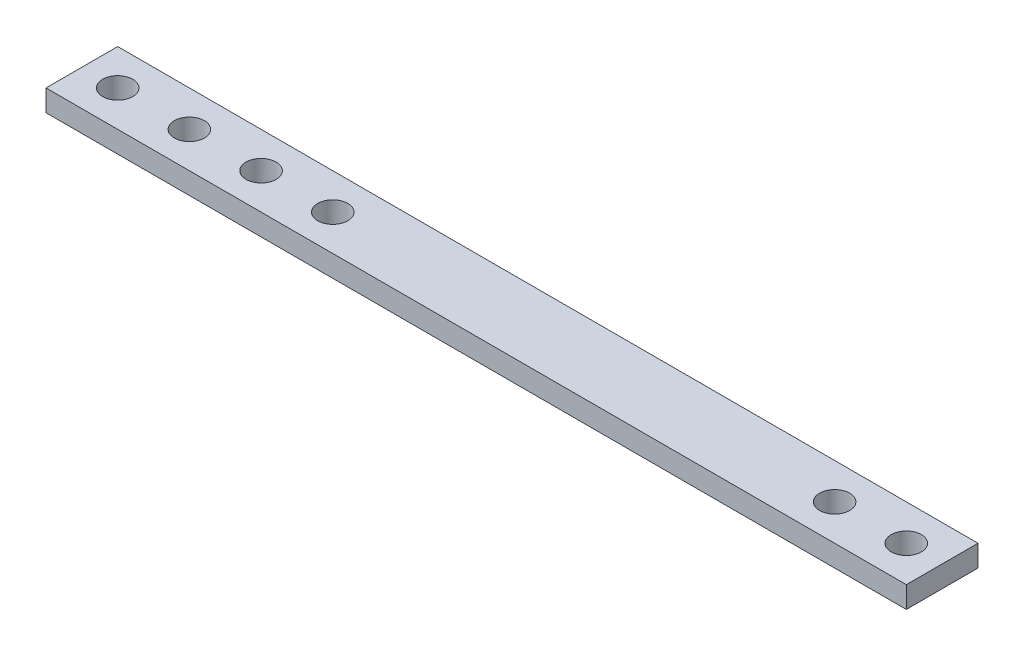
ISO-10303-21;
HEADER;
FILE_DESCRIPTION(('STEP AP214'),'2;1');
FILE_NAME('part.step','',(''),(''),'','','');
FILE_SCHEMA(('AUTOMOTIVE_DESIGN { 1 0 10303 214 1 1 1 1 }'));
ENDSEC;
DATA;
#1=APPLICATION_CONTEXT('core data for automotive mechanical design processes');
#2=APPLICATION_PROTOCOL_DEFINITION('international standard','automotive_design',2000,#1);
#3=PRODUCT_CONTEXT('',#1,'mechanical');
#4=PRODUCT('Part','Part','',(#3));
#5=PRODUCT_RELATED_PRODUCT_CATEGORY('part','',(#4));
#6=PRODUCT_DEFINITION_FORMATION('','',#4);
#7=PRODUCT_DEFINITION_CONTEXT('part definition',#1,'design');
#8=PRODUCT_DEFINITION('design','',#6,#7);
#9=PRODUCT_DEFINITION_SHAPE('','',#8);
#10=(LENGTH_UNIT() NAMED_UNIT(*) SI_UNIT(.MILLI.,.METRE.));
#11=(NAMED_UNIT(*) PLANE_ANGLE_UNIT() SI_UNIT($,.RADIAN.));
#12=(NAMED_UNIT(*) SI_UNIT($,.STERADIAN.) SOLID_ANGLE_UNIT());
#13=UNCERTAINTY_MEASURE_WITH_UNIT(LENGTH_MEASURE(1.E-05),#10,'distance_accuracy_value','');
#14=(GEOMETRIC_REPRESENTATION_CONTEXT(3) GLOBAL_UNCERTAINTY_ASSIGNED_CONTEXT((#13)) GLOBAL_UNIT_ASSIGNED_CONTEXT((#10,
#11,#12)) REPRESENTATION_CONTEXT('',''));
#15=CARTESIAN_POINT('',(0.,0.,0.));
#16=DIRECTION('',(0.,0.,1.));
#17=DIRECTION('',(1.,0.,0.));
#18=AXIS2_PLACEMENT_3D('',#15,#16,#17);
#19=CARTESIAN_POINT('',(0.,3.,0.));
#20=DIRECTION('',(0.,-1.,0.));
#21=DIRECTION('',(0.,0.,-1.));
#22=AXIS2_PLACEMENT_3D('',#19,#20,#21);
#23=PLANE('',#22);
#24=CARTESIAN_POINT('',(55.,3.,0.));
#25=DIRECTION('',(0.,1.,0.));
#26=DIRECTION('',(0.,0.,1.));
#27=AXIS2_PLACEMENT_3D('',#24,#25,#26);
#28=CIRCLE('',#27,2.1);
#29=CARTESIAN_POINT('',(55.,3.,2.1));
#30=VERTEX_POINT('',#29);
#31=EDGE_CURVE('E170',#30,#30,#28,.T.);
#32=ORIENTED_EDGE('',*,*,#31,.F.);
#33=EDGE_LOOP('',(#32));
#34=FACE_BOUND('',#33,.T.);
#35=CARTESIAN_POINT('',(45.,3.,0.));
#36=DIRECTION('',(0.,1.,0.));
#37=DIRECTION('',(0.,0.,1.));
#38=AXIS2_PLACEMENT_3D('',#35,#36,#37);
#39=CIRCLE('',#38,2.1);
#40=CARTESIAN_POINT('',(45.,3.,2.10000000000007));
#41=VERTEX_POINT('',#40);
#42=EDGE_CURVE('E162',#41,#41,#39,.T.);
#43=ORIENTED_EDGE('',*,*,#42,.F.);
#44=EDGE_LOOP('',(#43));
#45=FACE_BOUND('',#44,.T.);
#46=DIRECTION('',(0.,0.,-1.));
#47=VECTOR('',#46,1.);
#48=CARTESIAN_POINT('',(60.,3.,5.));
#49=LINE('',#48,#47);
#50=CARTESIAN_POINT('',(60.,3.,5.));
#51=VERTEX_POINT('',#50);
#52=CARTESIAN_POINT('',(60.,3.,-5.));
#53=VERTEX_POINT('',#52);
#54=EDGE_CURVE('E92',#51,#53,#49,.T.);
#55=ORIENTED_EDGE('',*,*,#54,.T.);
#56=DIRECTION('',(-1.,0.,0.));
#57=VECTOR('',#56,1.);
#58=CARTESIAN_POINT('',(-60.,3.,-5.));
#59=LINE('',#58,#57);
#60=CARTESIAN_POINT('',(-60.,3.,-5.));
#61=VERTEX_POINT('',#60);
#62=EDGE_CURVE('E87',#53,#61,#59,.T.);
#63=ORIENTED_EDGE('',*,*,#62,.T.);
#64=DIRECTION('',(0.,0.,1.));
#65=VECTOR('',#64,1.);
#66=CARTESIAN_POINT('',(-60.,3.,5.));
#67=LINE('',#66,#65);
#68=CARTESIAN_POINT('',(-60.,3.,5.));
#69=VERTEX_POINT('',#68);
#70=EDGE_CURVE('E90',#61,#69,#67,.T.);
#71=ORIENTED_EDGE('',*,*,#70,.T.);
#72=DIRECTION('',(1.,0.,0.));
#73=VECTOR('',#72,1.);
#74=CARTESIAN_POINT('',(-60.,3.,5.));
#75=LINE('',#74,#73);
#76=EDGE_CURVE('E57',#69,#51,#75,.T.);
#77=ORIENTED_EDGE('',*,*,#76,.T.);
#78=EDGE_LOOP('',(#55,#63,#71,#77));
#79=FACE_BOUND('',#78,.T.);
#80=CARTESIAN_POINT('',(-55.,3.,0.));
#81=DIRECTION('',(0.,1.,0.));
#82=DIRECTION('',(0.,0.,1.));
#83=AXIS2_PLACEMENT_3D('',#80,#81,#82);
#84=CIRCLE('',#83,2.1);
#85=CARTESIAN_POINT('',(-55.,3.,2.1));
#86=VERTEX_POINT('',#85);
#87=EDGE_CURVE('E112',#86,#86,#84,.T.);
#88=ORIENTED_EDGE('',*,*,#87,.F.);
#89=EDGE_LOOP('',(#88));
#90=FACE_BOUND('',#89,.T.);
#91=CARTESIAN_POINT('',(-45.,3.,0.));
#92=DIRECTION('',(0.,1.,0.));
#93=DIRECTION('',(0.,0.,1.));
#94=AXIS2_PLACEMENT_3D('',#91,#92,#93);
#95=CIRCLE('',#94,2.1);
#96=CARTESIAN_POINT('',(-45.,3.,2.1));
#97=VERTEX_POINT('',#96);
#98=EDGE_CURVE('E134',#97,#97,#95,.T.);
#99=ORIENTED_EDGE('',*,*,#98,.F.);
#100=EDGE_LOOP('',(#99));
#101=FACE_BOUND('',#100,.T.);
#102=CARTESIAN_POINT('',(-35.,3.,0.));
#103=DIRECTION('',(0.,1.,0.));
#104=DIRECTION('',(0.,0.,1.));
#105=AXIS2_PLACEMENT_3D('',#102,#103,#104);
#106=CIRCLE('',#105,2.1);
#107=CARTESIAN_POINT('',(-35.,3.,2.1));
#108=VERTEX_POINT('',#107);
#109=EDGE_CURVE('E142',#108,#108,#106,.T.);
#110=ORIENTED_EDGE('',*,*,#109,.F.);
#111=EDGE_LOOP('',(#110));
#112=FACE_BOUND('',#111,.T.);
#113=CARTESIAN_POINT('',(-25.,3.,0.));
#114=DIRECTION('',(0.,1.,0.));
#115=DIRECTION('',(0.,0.,1.));
#116=AXIS2_PLACEMENT_3D('',#113,#114,#115);
#117=CIRCLE('',#116,2.1);
#118=CARTESIAN_POINT('',(-25.,3.,2.1));
#119=VERTEX_POINT('',#118);
#120=EDGE_CURVE('E150',#119,#119,#117,.T.);
#121=ORIENTED_EDGE('',*,*,#120,.F.);
#122=EDGE_LOOP('',(#121));
#123=FACE_BOUND('',#122,.T.);
#124=ADVANCED_FACE('F39',(#34,#45,#79,#90,#101,#112,#123),#23,.F.);
#125=CARTESIAN_POINT('',(0.,0.,0.));
#126=DIRECTION('',(0.,-1.,0.));
#127=DIRECTION('',(0.,0.,-1.));
#128=AXIS2_PLACEMENT_3D('',#125,#126,#127);
#129=PLANE('',#128);
#130=CARTESIAN_POINT('',(55.,0.,0.));
#131=DIRECTION('',(0.,1.,0.));
#132=DIRECTION('',(0.,0.,1.));
#133=AXIS2_PLACEMENT_3D('',#130,#131,#132);
#134=CIRCLE('',#133,2.1);
#135=CARTESIAN_POINT('',(55.,0.,2.1));
#136=VERTEX_POINT('',#135);
#137=EDGE_CURVE('E158',#136,#136,#134,.T.);
#138=ORIENTED_EDGE('',*,*,#137,.T.);
#139=EDGE_LOOP('',(#138));
#140=FACE_BOUND('',#139,.T.);
#141=CARTESIAN_POINT('',(45.,0.,0.));
#142=DIRECTION('',(0.,1.,0.));
#143=DIRECTION('',(0.,0.,1.));
#144=AXIS2_PLACEMENT_3D('',#141,#142,#143);
#145=CIRCLE('',#144,2.1);
#146=CARTESIAN_POINT('',(45.,0.,2.10000000000007));
#147=VERTEX_POINT('',#146);
#148=EDGE_CURVE('E166',#147,#147,#145,.T.);
#149=ORIENTED_EDGE('',*,*,#148,.T.);
#150=EDGE_LOOP('',(#149));
#151=FACE_BOUND('',#150,.T.);
#152=CARTESIAN_POINT('',(-35.,0.,0.));
#153=DIRECTION('',(0.,1.,0.));
#154=DIRECTION('',(0.,0.,1.));
#155=AXIS2_PLACEMENT_3D('',#152,#153,#154);
#156=CIRCLE('',#155,2.1);
#157=CARTESIAN_POINT('',(-35.,0.,2.1));
#158=VERTEX_POINT('',#157);
#159=EDGE_CURVE('E146',#158,#158,#156,.T.);
#160=ORIENTED_EDGE('',*,*,#159,.T.);
#161=EDGE_LOOP('',(#160));
#162=FACE_BOUND('',#161,.T.);
#163=CARTESIAN_POINT('',(-55.,0.,0.));
#164=DIRECTION('',(0.,1.,0.));
#165=DIRECTION('',(0.,0.,1.));
#166=AXIS2_PLACEMENT_3D('',#163,#164,#165);
#167=CIRCLE('',#166,2.1);
#168=CARTESIAN_POINT('',(-55.,0.,2.1));
#169=VERTEX_POINT('',#168);
#170=EDGE_CURVE('E130',#169,#169,#167,.T.);
#171=ORIENTED_EDGE('',*,*,#170,.T.);
#172=EDGE_LOOP('',(#171));
#173=FACE_BOUND('',#172,.T.);
#174=DIRECTION('',(0.,0.,-1.));
#175=VECTOR('',#174,1.);
#176=CARTESIAN_POINT('',(60.,0.,5.));
#177=LINE('',#176,#175);
#178=CARTESIAN_POINT('',(60.,0.,5.));
#179=VERTEX_POINT('',#178);
#180=CARTESIAN_POINT('',(60.,0.,-5.));
#181=VERTEX_POINT('',#180);
#182=EDGE_CURVE('E108',#179,#181,#177,.T.);
#183=ORIENTED_EDGE('',*,*,#182,.F.);
#184=DIRECTION('',(1.,0.,0.));
#185=VECTOR('',#184,1.);
#186=CARTESIAN_POINT('',(-60.,0.,5.));
#187=LINE('',#186,#185);
#188=CARTESIAN_POINT('',(-60.,0.,5.));
#189=VERTEX_POINT('',#188);
#190=EDGE_CURVE('E80',#189,#179,#187,.T.);
#191=ORIENTED_EDGE('',*,*,#190,.F.);
#192=DIRECTION('',(0.,0.,1.));
#193=VECTOR('',#192,1.);
#194=CARTESIAN_POINT('',(-60.,0.,5.));
#195=LINE('',#194,#193);
#196=CARTESIAN_POINT('',(-60.,0.,-5.));
#197=VERTEX_POINT('',#196);
#198=EDGE_CURVE('E74',#197,#189,#195,.T.);
#199=ORIENTED_EDGE('',*,*,#198,.F.);
#200=DIRECTION('',(-1.,0.,0.));
#201=VECTOR('',#200,1.);
#202=CARTESIAN_POINT('',(-60.,0.,-5.));
#203=LINE('',#202,#201);
#204=EDGE_CURVE('E97',#181,#197,#203,.T.);
#205=ORIENTED_EDGE('',*,*,#204,.F.);
#206=EDGE_LOOP('',(#183,#191,#199,#205));
#207=FACE_BOUND('',#206,.T.);
#208=CARTESIAN_POINT('',(-45.,0.,0.));
#209=DIRECTION('',(0.,1.,0.));
#210=DIRECTION('',(0.,0.,1.));
#211=AXIS2_PLACEMENT_3D('',#208,#209,#210);
#212=CIRCLE('',#211,2.1);
#213=CARTESIAN_POINT('',(-45.,0.,2.1));
#214=VERTEX_POINT('',#213);
#215=EDGE_CURVE('E138',#214,#214,#212,.T.);
#216=ORIENTED_EDGE('',*,*,#215,.T.);
#217=EDGE_LOOP('',(#216));
#218=FACE_BOUND('',#217,.T.);
#219=CARTESIAN_POINT('',(-25.,0.,0.));
#220=DIRECTION('',(0.,1.,0.));
#221=DIRECTION('',(0.,0.,1.));
#222=AXIS2_PLACEMENT_3D('',#219,#220,#221);
#223=CIRCLE('',#222,2.1);
#224=CARTESIAN_POINT('',(-25.,0.,2.1));
#225=VERTEX_POINT('',#224);
#226=EDGE_CURVE('E154',#225,#225,#223,.T.);
#227=ORIENTED_EDGE('',*,*,#226,.T.);
#228=EDGE_LOOP('',(#227));
#229=FACE_BOUND('',#228,.T.);
#230=ADVANCED_FACE('F125',(#140,#151,#162,#173,#207,#218,#229),#129,.T.);
#231=CARTESIAN_POINT('',(60.,3.,5.));
#232=DIRECTION('',(-1.,0.,0.));
#233=DIRECTION('',(0.,0.,1.));
#234=AXIS2_PLACEMENT_3D('',#231,#232,#233);
#235=PLANE('',#234);
#236=ORIENTED_EDGE('',*,*,#182,.T.);
#237=DIRECTION('',(0.,-1.,0.));
#238=VECTOR('',#237,1.);
#239=CARTESIAN_POINT('',(60.,3.,-5.));
#240=LINE('',#239,#238);
#241=EDGE_CURVE('E11',#53,#181,#240,.T.);
#242=ORIENTED_EDGE('',*,*,#241,.F.);
#243=ORIENTED_EDGE('',*,*,#54,.F.);
#244=DIRECTION('',(0.,-1.,0.));
#245=VECTOR('',#244,1.);
#246=CARTESIAN_POINT('',(60.,3.,5.));
#247=LINE('',#246,#245);
#248=EDGE_CURVE('E104',#51,#179,#247,.T.);
#249=ORIENTED_EDGE('',*,*,#248,.T.);
#250=EDGE_LOOP('',(#236,#242,#243,#249));
#251=FACE_BOUND('',#250,.T.);
#252=ADVANCED_FACE('F41',(#251),#235,.F.);
#253=CARTESIAN_POINT('',(-60.,3.,-5.));
#254=DIRECTION('',(0.,0.,1.));
#255=DIRECTION('',(1.,0.,0.));
#256=AXIS2_PLACEMENT_3D('',#253,#254,#255);
#257=PLANE('',#256);
#258=ORIENTED_EDGE('',*,*,#204,.T.);
#259=DIRECTION('',(0.,-1.,0.));
#260=VECTOR('',#259,1.);
#261=CARTESIAN_POINT('',(-60.,3.,-5.));
#262=LINE('',#261,#260);
#263=EDGE_CURVE('E49',#61,#197,#262,.T.);
#264=ORIENTED_EDGE('',*,*,#263,.F.);
#265=ORIENTED_EDGE('',*,*,#62,.F.);
#266=ORIENTED_EDGE('',*,*,#241,.T.);
#267=EDGE_LOOP('',(#258,#264,#265,#266));
#268=FACE_BOUND('',#267,.T.);
#269=ADVANCED_FACE('F96',(#268),#257,.F.);
#270=CARTESIAN_POINT('',(-60.,3.,5.));
#271=DIRECTION('',(1.,0.,0.));
#272=DIRECTION('',(0.,0.,-1.));
#273=AXIS2_PLACEMENT_3D('',#270,#271,#272);
#274=PLANE('',#273);
#275=ORIENTED_EDGE('',*,*,#198,.T.);
#276=DIRECTION('',(0.,-1.,0.));
#277=VECTOR('',#276,1.);
#278=CARTESIAN_POINT('',(-60.,3.,5.));
#279=LINE('',#278,#277);
#280=EDGE_CURVE('E99',#69,#189,#279,.T.);
#281=ORIENTED_EDGE('',*,*,#280,.F.);
#282=ORIENTED_EDGE('',*,*,#70,.F.);
#283=ORIENTED_EDGE('',*,*,#263,.T.);
#284=EDGE_LOOP('',(#275,#281,#282,#283));
#285=FACE_BOUND('',#284,.T.);
#286=ADVANCED_FACE('F100',(#285),#274,.F.);
#287=CARTESIAN_POINT('',(-60.,3.,5.));
#288=DIRECTION('',(0.,0.,-1.));
#289=DIRECTION('',(-1.,0.,0.));
#290=AXIS2_PLACEMENT_3D('',#287,#288,#289);
#291=PLANE('',#290);
#292=ORIENTED_EDGE('',*,*,#190,.T.);
#293=ORIENTED_EDGE('',*,*,#248,.F.);
#294=ORIENTED_EDGE('',*,*,#76,.F.);
#295=ORIENTED_EDGE('',*,*,#280,.T.);
#296=EDGE_LOOP('',(#292,#293,#294,#295));
#297=FACE_BOUND('',#296,.T.);
#298=ADVANCED_FACE('F122',(#297),#291,.F.);
#299=CARTESIAN_POINT('',(-55.,3.,0.));
#300=DIRECTION('',(0.,-1.,0.));
#301=DIRECTION('',(0.,0.,-1.));
#302=AXIS2_PLACEMENT_3D('',#299,#300,#301);
#303=CYLINDRICAL_SURFACE('',#302,2.1);
#304=ORIENTED_EDGE('',*,*,#87,.T.);
#305=EDGE_LOOP('',(#304));
#306=FACE_BOUND('',#305,.T.);
#307=ORIENTED_EDGE('',*,*,#170,.F.);
#308=EDGE_LOOP('',(#307));
#309=FACE_BOUND('',#308,.T.);
#310=ADVANCED_FACE('F210',(#306,#309),#303,.F.);
#311=CARTESIAN_POINT('',(-45.,3.,0.));
#312=DIRECTION('',(0.,-1.,0.));
#313=DIRECTION('',(0.,0.,-1.));
#314=AXIS2_PLACEMENT_3D('',#311,#312,#313);
#315=CYLINDRICAL_SURFACE('',#314,2.1);
#316=ORIENTED_EDGE('',*,*,#98,.T.);
#317=EDGE_LOOP('',(#316));
#318=FACE_BOUND('',#317,.T.);
#319=ORIENTED_EDGE('',*,*,#215,.F.);
#320=EDGE_LOOP('',(#319));
#321=FACE_BOUND('',#320,.T.);
#322=ADVANCED_FACE('F206',(#318,#321),#315,.F.);
#323=CARTESIAN_POINT('',(-35.,3.,0.));
#324=DIRECTION('',(0.,-1.,0.));
#325=DIRECTION('',(0.,0.,-1.));
#326=AXIS2_PLACEMENT_3D('',#323,#324,#325);
#327=CYLINDRICAL_SURFACE('',#326,2.1);
#328=ORIENTED_EDGE('',*,*,#109,.T.);
#329=EDGE_LOOP('',(#328));
#330=FACE_BOUND('',#329,.T.);
#331=ORIENTED_EDGE('',*,*,#159,.F.);
#332=EDGE_LOOP('',(#331));
#333=FACE_BOUND('',#332,.T.);
#334=ADVANCED_FACE('F199',(#330,#333),#327,.F.);
#335=CARTESIAN_POINT('',(-25.,3.,0.));
#336=DIRECTION('',(0.,-1.,0.));
#337=DIRECTION('',(0.,0.,-1.));
#338=AXIS2_PLACEMENT_3D('',#335,#336,#337);
#339=CYLINDRICAL_SURFACE('',#338,2.1);
#340=ORIENTED_EDGE('',*,*,#120,.T.);
#341=EDGE_LOOP('',(#340));
#342=FACE_BOUND('',#341,.T.);
#343=ORIENTED_EDGE('',*,*,#226,.F.);
#344=EDGE_LOOP('',(#343));
#345=FACE_BOUND('',#344,.T.);
#346=ADVANCED_FACE('F193',(#342,#345),#339,.F.);
#347=CARTESIAN_POINT('',(45.,0.,0.));
#348=DIRECTION('',(0.,1.,0.));
#349=DIRECTION('',(0.,0.,1.));
#350=AXIS2_PLACEMENT_3D('',#347,#348,#349);
#351=CYLINDRICAL_SURFACE('',#350,2.1);
#352=ORIENTED_EDGE('',*,*,#148,.F.);
#353=EDGE_LOOP('',(#352));
#354=FACE_BOUND('',#353,.T.);
#355=ORIENTED_EDGE('',*,*,#42,.T.);
#356=EDGE_LOOP('',(#355));
#357=FACE_BOUND('',#356,.T.);
#358=ADVANCED_FACE('F183',(#354,#357),#351,.F.);
#359=CARTESIAN_POINT('',(55.,0.,0.));
#360=DIRECTION('',(0.,1.,0.));
#361=DIRECTION('',(0.,0.,1.));
#362=AXIS2_PLACEMENT_3D('',#359,#360,#361);
#363=CYLINDRICAL_SURFACE('',#362,2.1);
#364=ORIENTED_EDGE('',*,*,#137,.F.);
#365=EDGE_LOOP('',(#364));
#366=FACE_BOUND('',#365,.T.);
#367=ORIENTED_EDGE('',*,*,#31,.T.);
#368=EDGE_LOOP('',(#367));
#369=FACE_BOUND('',#368,.T.);
#370=ADVANCED_FACE('F180',(#366,#369),#363,.F.);
#371=CLOSED_SHELL('',(#124,#230,#252,#269,#286,#298,#310,#322,#334,#346,#358,#370));
#372=MANIFOLD_SOLID_BREP('B2',#371);
#373=ADVANCED_BREP_SHAPE_REPRESENTATION('',(#18,#372),#14);
#374=SHAPE_DEFINITION_REPRESENTATION(#9,#373);
ENDSEC;
END-ISO-10303-21;
